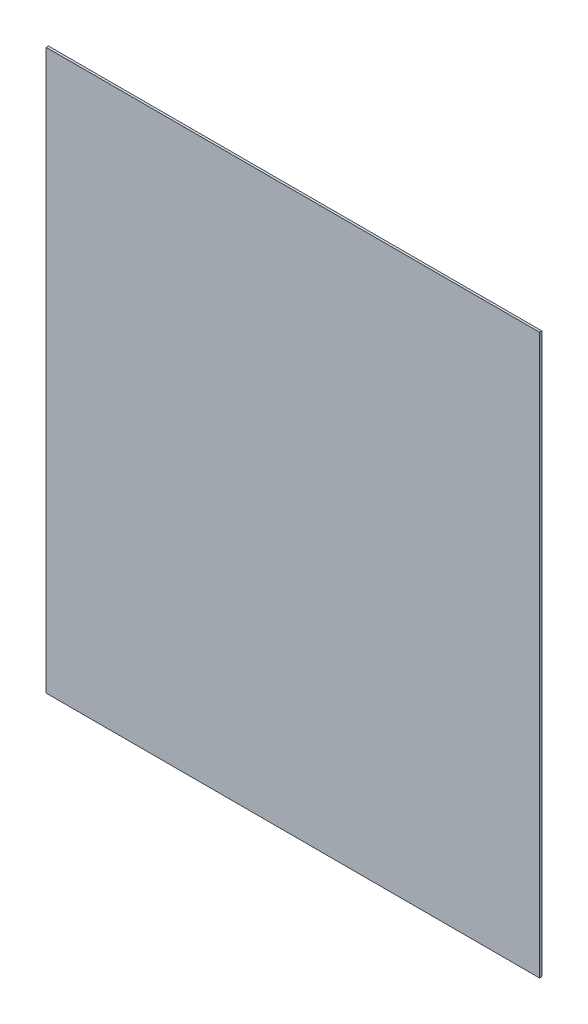
ISO-10303-21;
HEADER;
FILE_DESCRIPTION(('STEP AP214'),'2;1');
FILE_NAME('part.step','',(''),(''),'','','');
FILE_SCHEMA(('AUTOMOTIVE_DESIGN { 1 0 10303 214 1 1 1 1 }'));
ENDSEC;
DATA;
#1=APPLICATION_CONTEXT('core data for automotive mechanical design processes');
#2=APPLICATION_PROTOCOL_DEFINITION('international standard','automotive_design',2000,#1);
#3=PRODUCT_CONTEXT('',#1,'mechanical');
#4=PRODUCT('Part','Part','',(#3));
#5=PRODUCT_RELATED_PRODUCT_CATEGORY('part','',(#4));
#6=PRODUCT_DEFINITION_FORMATION('','',#4);
#7=PRODUCT_DEFINITION_CONTEXT('part definition',#1,'design');
#8=PRODUCT_DEFINITION('design','',#6,#7);
#9=PRODUCT_DEFINITION_SHAPE('','',#8);
#10=(LENGTH_UNIT() NAMED_UNIT(*) SI_UNIT(.MILLI.,.METRE.));
#11=(NAMED_UNIT(*) PLANE_ANGLE_UNIT() SI_UNIT($,.RADIAN.));
#12=(NAMED_UNIT(*) SI_UNIT($,.STERADIAN.) SOLID_ANGLE_UNIT());
#13=UNCERTAINTY_MEASURE_WITH_UNIT(LENGTH_MEASURE(1.E-05),#10,'distance_accuracy_value','');
#14=(GEOMETRIC_REPRESENTATION_CONTEXT(3) GLOBAL_UNCERTAINTY_ASSIGNED_CONTEXT((#13)) GLOBAL_UNIT_ASSIGNED_CONTEXT((#10,
#11,#12)) REPRESENTATION_CONTEXT('',''));
#15=CARTESIAN_POINT('',(0.,0.,0.));
#16=DIRECTION('',(0.,0.,1.));
#17=DIRECTION('',(1.,0.,0.));
#18=AXIS2_PLACEMENT_3D('',#15,#16,#17);
#19=CARTESIAN_POINT('',(266.7,-302.26,2.54));
#20=DIRECTION('',(-1.,0.,0.));
#21=DIRECTION('',(0.,0.,1.));
#22=AXIS2_PLACEMENT_3D('',#19,#20,#21);
#23=PLANE('',#22);
#24=DIRECTION('',(0.,1.,0.));
#25=VECTOR('',#24,1.);
#26=CARTESIAN_POINT('',(266.7,-302.26,0.));
#27=LINE('',#26,#25);
#28=CARTESIAN_POINT('',(266.7,-302.26,0.));
#29=VERTEX_POINT('',#28);
#30=CARTESIAN_POINT('',(266.7,302.26,0.));
#31=VERTEX_POINT('',#30);
#32=EDGE_CURVE('E96',#29,#31,#27,.T.);
#33=ORIENTED_EDGE('',*,*,#32,.T.);
#34=DIRECTION('',(0.,0.,-1.));
#35=VECTOR('',#34,1.);
#36=CARTESIAN_POINT('',(266.7,302.26,2.54));
#37=LINE('',#36,#35);
#38=CARTESIAN_POINT('',(266.7,302.26,2.54));
#39=VERTEX_POINT('',#38);
#40=EDGE_CURVE('E11',#39,#31,#37,.T.);
#41=ORIENTED_EDGE('',*,*,#40,.F.);
#42=DIRECTION('',(0.,1.,0.));
#43=VECTOR('',#42,1.);
#44=CARTESIAN_POINT('',(266.7,-302.26,2.54));
#45=LINE('',#44,#43);
#46=CARTESIAN_POINT('',(266.7,-302.26,2.54));
#47=VERTEX_POINT('',#46);
#48=EDGE_CURVE('E84',#47,#39,#45,.T.);
#49=ORIENTED_EDGE('',*,*,#48,.F.);
#50=DIRECTION('',(0.,0.,-1.));
#51=VECTOR('',#50,1.);
#52=CARTESIAN_POINT('',(266.7,-302.26,2.54));
#53=LINE('',#52,#51);
#54=EDGE_CURVE('E92',#47,#29,#53,.T.);
#55=ORIENTED_EDGE('',*,*,#54,.T.);
#56=EDGE_LOOP('',(#33,#41,#49,#55));
#57=FACE_BOUND('',#56,.T.);
#58=ADVANCED_FACE('F33',(#57),#23,.F.);
#59=CARTESIAN_POINT('',(-266.7,302.26,2.54));
#60=DIRECTION('',(0.,-1.,0.));
#61=DIRECTION('',(0.,0.,-1.));
#62=AXIS2_PLACEMENT_3D('',#59,#60,#61);
#63=PLANE('',#62);
#64=DIRECTION('',(-1.,0.,0.));
#65=VECTOR('',#64,1.);
#66=CARTESIAN_POINT('',(-266.7,302.26,0.));
#67=LINE('',#66,#65);
#68=CARTESIAN_POINT('',(-266.7,302.26,0.));
#69=VERTEX_POINT('',#68);
#70=EDGE_CURVE('E88',#31,#69,#67,.T.);
#71=ORIENTED_EDGE('',*,*,#70,.T.);
#72=DIRECTION('',(0.,0.,-1.));
#73=VECTOR('',#72,1.);
#74=CARTESIAN_POINT('',(-266.7,302.26,2.54));
#75=LINE('',#74,#73);
#76=CARTESIAN_POINT('',(-266.7,302.26,2.54));
#77=VERTEX_POINT('',#76);
#78=EDGE_CURVE('E41',#77,#69,#75,.T.);
#79=ORIENTED_EDGE('',*,*,#78,.F.);
#80=DIRECTION('',(-1.,0.,0.));
#81=VECTOR('',#80,1.);
#82=CARTESIAN_POINT('',(-266.7,302.26,2.54));
#83=LINE('',#82,#81);
#84=EDGE_CURVE('E79',#39,#77,#83,.T.);
#85=ORIENTED_EDGE('',*,*,#84,.F.);
#86=ORIENTED_EDGE('',*,*,#40,.T.);
#87=EDGE_LOOP('',(#71,#79,#85,#86));
#88=FACE_BOUND('',#87,.T.);
#89=ADVANCED_FACE('F87',(#88),#63,.F.);
#90=CARTESIAN_POINT('',(-266.7,-302.26,2.54));
#91=DIRECTION('',(1.,0.,0.));
#92=DIRECTION('',(0.,0.,-1.));
#93=AXIS2_PLACEMENT_3D('',#90,#91,#92);
#94=PLANE('',#93);
#95=DIRECTION('',(0.,-1.,0.));
#96=VECTOR('',#95,1.);
#97=CARTESIAN_POINT('',(-266.7,-302.26,0.));
#98=LINE('',#97,#96);
#99=CARTESIAN_POINT('',(-266.7,-302.26,0.));
#100=VERTEX_POINT('',#99);
#101=EDGE_CURVE('E66',#69,#100,#98,.T.);
#102=ORIENTED_EDGE('',*,*,#101,.T.);
#103=DIRECTION('',(0.,0.,-1.));
#104=VECTOR('',#103,1.);
#105=CARTESIAN_POINT('',(-266.7,-302.26,2.54));
#106=LINE('',#105,#104);
#107=CARTESIAN_POINT('',(-266.7,-302.26,2.54));
#108=VERTEX_POINT('',#107);
#109=EDGE_CURVE('E89',#108,#100,#106,.T.);
#110=ORIENTED_EDGE('',*,*,#109,.F.);
#111=DIRECTION('',(0.,-1.,0.));
#112=VECTOR('',#111,1.);
#113=CARTESIAN_POINT('',(-266.7,-302.26,2.54));
#114=LINE('',#113,#112);
#115=EDGE_CURVE('E82',#77,#108,#114,.T.);
#116=ORIENTED_EDGE('',*,*,#115,.F.);
#117=ORIENTED_EDGE('',*,*,#78,.T.);
#118=EDGE_LOOP('',(#102,#110,#116,#117));
#119=FACE_BOUND('',#118,.T.);
#120=ADVANCED_FACE('F90',(#119),#94,.F.);
#121=CARTESIAN_POINT('',(-266.7,-302.26,2.54));
#122=DIRECTION('',(0.,1.,0.));
#123=DIRECTION('',(0.,0.,1.));
#124=AXIS2_PLACEMENT_3D('',#121,#122,#123);
#125=PLANE('',#124);
#126=DIRECTION('',(1.,0.,0.));
#127=VECTOR('',#126,1.);
#128=CARTESIAN_POINT('',(-266.7,-302.26,0.));
#129=LINE('',#128,#127);
#130=EDGE_CURVE('E72',#100,#29,#129,.T.);
#131=ORIENTED_EDGE('',*,*,#130,.T.);
#132=ORIENTED_EDGE('',*,*,#54,.F.);
#133=DIRECTION('',(1.,0.,0.));
#134=VECTOR('',#133,1.);
#135=CARTESIAN_POINT('',(-266.7,-302.26,2.54));
#136=LINE('',#135,#134);
#137=EDGE_CURVE('E49',#108,#47,#136,.T.);
#138=ORIENTED_EDGE('',*,*,#137,.F.);
#139=ORIENTED_EDGE('',*,*,#109,.T.);
#140=EDGE_LOOP('',(#131,#132,#138,#139));
#141=FACE_BOUND('',#140,.T.);
#142=ADVANCED_FACE('F103',(#141),#125,.F.);
#143=CARTESIAN_POINT('',(0.,0.,2.54));
#144=DIRECTION('',(0.,0.,-1.));
#145=DIRECTION('',(-1.,0.,0.));
#146=AXIS2_PLACEMENT_3D('',#143,#144,#145);
#147=PLANE('',#146);
#148=ORIENTED_EDGE('',*,*,#48,.T.);
#149=ORIENTED_EDGE('',*,*,#84,.T.);
#150=ORIENTED_EDGE('',*,*,#115,.T.);
#151=ORIENTED_EDGE('',*,*,#137,.T.);
#152=EDGE_LOOP('',(#148,#149,#150,#151));
#153=FACE_BOUND('',#152,.T.);
#154=ADVANCED_FACE('F80',(#153),#147,.F.);
#155=CARTESIAN_POINT('',(0.,0.,0.));
#156=DIRECTION('',(0.,0.,-1.));
#157=DIRECTION('',(-1.,0.,0.));
#158=AXIS2_PLACEMENT_3D('',#155,#156,#157);
#159=PLANE('',#158);
#160=ORIENTED_EDGE('',*,*,#32,.F.);
#161=ORIENTED_EDGE('',*,*,#130,.F.);
#162=ORIENTED_EDGE('',*,*,#101,.F.);
#163=ORIENTED_EDGE('',*,*,#70,.F.);
#164=EDGE_LOOP('',(#160,#161,#162,#163));
#165=FACE_BOUND('',#164,.T.);
#166=ADVANCED_FACE('F106',(#165),#159,.T.);
#167=CLOSED_SHELL('',(#58,#89,#120,#142,#154,#166));
#168=MANIFOLD_SOLID_BREP('B2',#167);
#169=ADVANCED_BREP_SHAPE_REPRESENTATION('',(#18,#168),#14);
#170=SHAPE_DEFINITION_REPRESENTATION(#9,#169);
ENDSEC;
END-ISO-10303-21;
